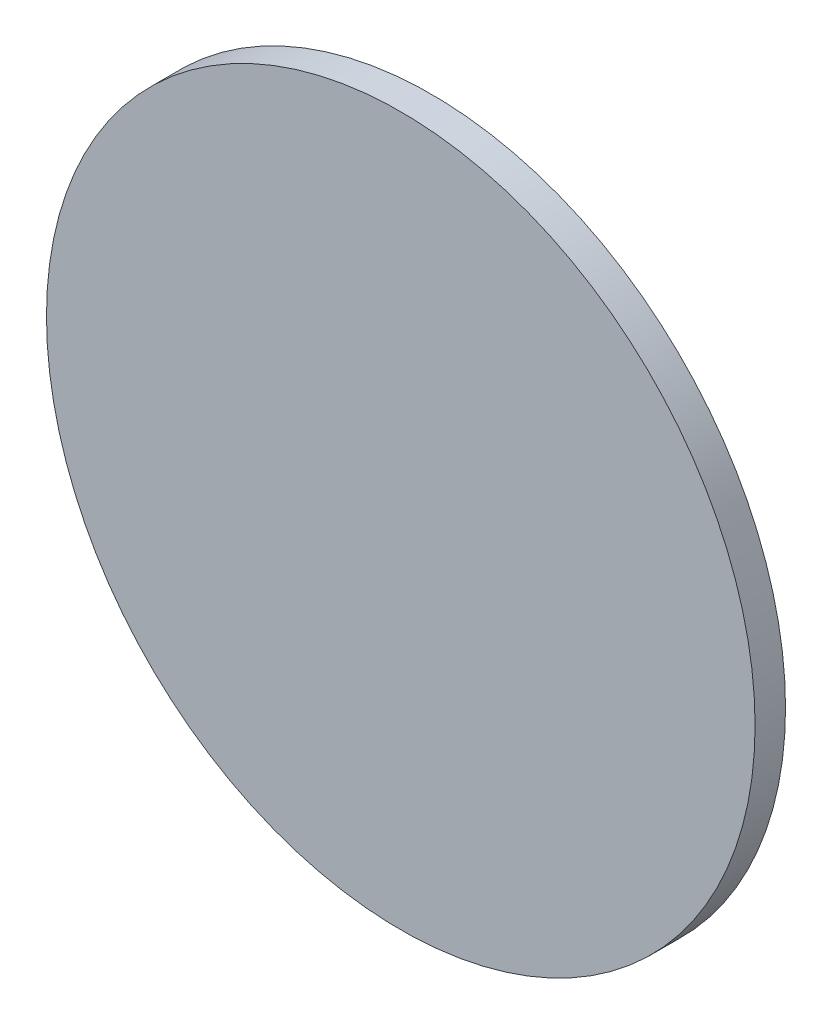
ISO-10303-21;
HEADER;
FILE_DESCRIPTION(('STEP AP214'),'2;1');
FILE_NAME('part.step','',(''),(''),'','','');
FILE_SCHEMA(('AUTOMOTIVE_DESIGN { 1 0 10303 214 1 1 1 1 }'));
ENDSEC;
DATA;
#1=APPLICATION_CONTEXT('core data for automotive mechanical design processes');
#2=APPLICATION_PROTOCOL_DEFINITION('international standard','automotive_design',2000,#1);
#3=PRODUCT_CONTEXT('',#1,'mechanical');
#4=PRODUCT('Part','Part','',(#3));
#5=PRODUCT_RELATED_PRODUCT_CATEGORY('part','',(#4));
#6=PRODUCT_DEFINITION_FORMATION('','',#4);
#7=PRODUCT_DEFINITION_CONTEXT('part definition',#1,'design');
#8=PRODUCT_DEFINITION('design','',#6,#7);
#9=PRODUCT_DEFINITION_SHAPE('','',#8);
#10=(LENGTH_UNIT() NAMED_UNIT(*) SI_UNIT(.MILLI.,.METRE.));
#11=(NAMED_UNIT(*) PLANE_ANGLE_UNIT() SI_UNIT($,.RADIAN.));
#12=(NAMED_UNIT(*) SI_UNIT($,.STERADIAN.) SOLID_ANGLE_UNIT());
#13=UNCERTAINTY_MEASURE_WITH_UNIT(LENGTH_MEASURE(1.E-05),#10,'distance_accuracy_value','');
#14=(GEOMETRIC_REPRESENTATION_CONTEXT(3) GLOBAL_UNCERTAINTY_ASSIGNED_CONTEXT((#13)) GLOBAL_UNIT_ASSIGNED_CONTEXT((#10,
#11,#12)) REPRESENTATION_CONTEXT('',''));
#15=CARTESIAN_POINT('',(0.,0.,0.));
#16=DIRECTION('',(0.,0.,1.));
#17=DIRECTION('',(1.,0.,0.));
#18=AXIS2_PLACEMENT_3D('',#15,#16,#17);
#19=CARTESIAN_POINT('',(0.,0.,6.35));
#20=DIRECTION('',(0.,0.,-1.));
#21=DIRECTION('',(-1.,0.,0.));
#22=AXIS2_PLACEMENT_3D('',#19,#20,#21);
#23=CYLINDRICAL_SURFACE('',#22,73.914);
#24=CARTESIAN_POINT('',(0.,0.,6.35));
#25=DIRECTION('',(0.,0.,1.));
#26=DIRECTION('',(1.,0.,0.));
#27=AXIS2_PLACEMENT_3D('',#24,#25,#26);
#28=CIRCLE('',#27,73.914);
#29=CARTESIAN_POINT('',(73.914,0.,6.35));
#30=VERTEX_POINT('',#29);
#31=EDGE_CURVE('E10',#30,#30,#28,.T.);
#32=ORIENTED_EDGE('',*,*,#31,.F.);
#33=EDGE_LOOP('',(#32));
#34=FACE_BOUND('',#33,.T.);
#35=CARTESIAN_POINT('',(0.,0.,0.));
#36=DIRECTION('',(0.,0.,1.));
#37=DIRECTION('',(1.,0.,0.));
#38=AXIS2_PLACEMENT_3D('',#35,#36,#37);
#39=CIRCLE('',#38,73.914);
#40=CARTESIAN_POINT('',(73.914,0.,0.));
#41=VERTEX_POINT('',#40);
#42=EDGE_CURVE('E33',#41,#41,#39,.T.);
#43=ORIENTED_EDGE('',*,*,#42,.T.);
#44=EDGE_LOOP('',(#43));
#45=FACE_BOUND('',#44,.T.);
#46=ADVANCED_FACE('F30',(#34,#45),#23,.T.);
#47=CARTESIAN_POINT('',(0.,0.,6.35));
#48=DIRECTION('',(0.,0.,1.));
#49=DIRECTION('',(1.,0.,0.));
#50=AXIS2_PLACEMENT_3D('',#47,#48,#49);
#51=PLANE('',#50);
#52=ORIENTED_EDGE('',*,*,#31,.T.);
#53=EDGE_LOOP('',(#52));
#54=FACE_BOUND('',#53,.T.);
#55=ADVANCED_FACE('F45',(#54),#51,.T.);
#56=CARTESIAN_POINT('',(0.,0.,0.));
#57=DIRECTION('',(0.,0.,1.));
#58=DIRECTION('',(1.,0.,0.));
#59=AXIS2_PLACEMENT_3D('',#56,#57,#58);
#60=PLANE('',#59);
#61=ORIENTED_EDGE('',*,*,#42,.F.);
#62=EDGE_LOOP('',(#61));
#63=FACE_BOUND('',#62,.T.);
#64=ADVANCED_FACE('F43',(#63),#60,.F.);
#65=CLOSED_SHELL('',(#46,#55,#64));
#66=MANIFOLD_SOLID_BREP('B2',#65);
#67=ADVANCED_BREP_SHAPE_REPRESENTATION('',(#18,#66),#14);
#68=SHAPE_DEFINITION_REPRESENTATION(#9,#67);
ENDSEC;
END-ISO-10303-21;
